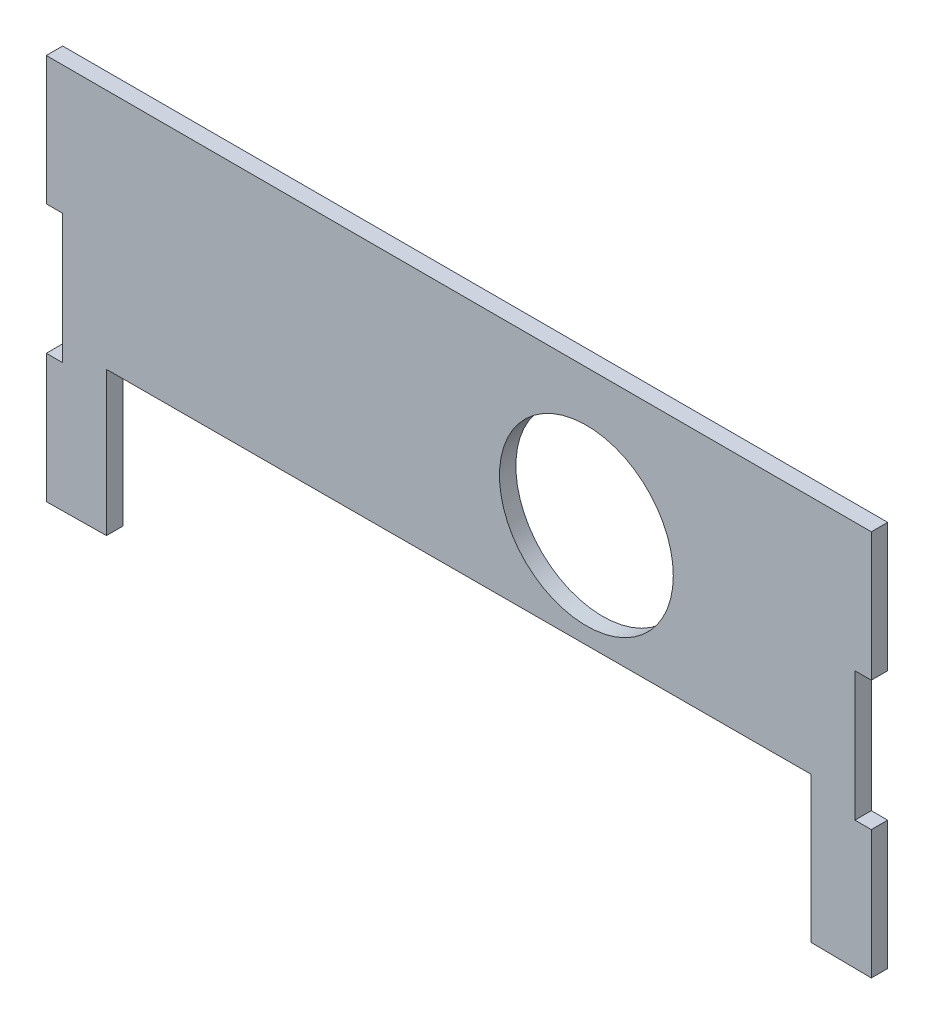
ISO-10303-21;
HEADER;
FILE_DESCRIPTION(('STEP AP214'),'2;1');
FILE_NAME('part.step','',(''),(''),'','','');
FILE_SCHEMA(('AUTOMOTIVE_DESIGN { 1 0 10303 214 1 1 1 1 }'));
ENDSEC;
DATA;
#1=APPLICATION_CONTEXT('core data for automotive mechanical design processes');
#2=APPLICATION_PROTOCOL_DEFINITION('international standard','automotive_design',2000,#1);
#3=PRODUCT_CONTEXT('',#1,'mechanical');
#4=PRODUCT('Part','Part','',(#3));
#5=PRODUCT_RELATED_PRODUCT_CATEGORY('part','',(#4));
#6=PRODUCT_DEFINITION_FORMATION('','',#4);
#7=PRODUCT_DEFINITION_CONTEXT('part definition',#1,'design');
#8=PRODUCT_DEFINITION('design','',#6,#7);
#9=PRODUCT_DEFINITION_SHAPE('','',#8);
#10=(LENGTH_UNIT() NAMED_UNIT(*) SI_UNIT(.MILLI.,.METRE.));
#11=(NAMED_UNIT(*) PLANE_ANGLE_UNIT() SI_UNIT($,.RADIAN.));
#12=(NAMED_UNIT(*) SI_UNIT($,.STERADIAN.) SOLID_ANGLE_UNIT());
#13=UNCERTAINTY_MEASURE_WITH_UNIT(LENGTH_MEASURE(1.E-05),#10,'distance_accuracy_value','');
#14=(GEOMETRIC_REPRESENTATION_CONTEXT(3) GLOBAL_UNCERTAINTY_ASSIGNED_CONTEXT((#13)) GLOBAL_UNIT_ASSIGNED_CONTEXT((#10,
#11,#12)) REPRESENTATION_CONTEXT('',''));
#15=CARTESIAN_POINT('',(0.,0.,0.));
#16=DIRECTION('',(0.,0.,1.));
#17=DIRECTION('',(1.,0.,0.));
#18=AXIS2_PLACEMENT_3D('',#15,#16,#17);
#19=CARTESIAN_POINT('',(0.,0.,3.));
#20=DIRECTION('',(0.,0.,1.));
#21=DIRECTION('',(1.,0.,0.));
#22=AXIS2_PLACEMENT_3D('',#19,#20,#21);
#23=PLANE('',#22);
#24=DIRECTION('',(-1.,0.,0.));
#25=VECTOR('',#24,1.);
#26=CARTESIAN_POINT('',(505.065088389252,145.519127811758,3.));
#27=LINE('',#26,#25);
#28=CARTESIAN_POINT('',(505.065088389252,145.519127811758,3.));
#29=VERTEX_POINT('',#28);
#30=CARTESIAN_POINT('',(502.065100889252,145.519127811758,3.));
#31=VERTEX_POINT('',#30);
#32=EDGE_CURVE('E210',#29,#31,#27,.T.);
#33=ORIENTED_EDGE('',*,*,#32,.T.);
#34=DIRECTION('',(0.,-1.,0.));
#35=VECTOR('',#34,1.);
#36=CARTESIAN_POINT('',(502.065100889252,145.519127811758,3.));
#37=LINE('',#36,#35);
#38=CARTESIAN_POINT('',(502.065100889252,121.994142811758,3.));
#39=VERTEX_POINT('',#38);
#40=EDGE_CURVE('E117',#31,#39,#37,.T.);
#41=ORIENTED_EDGE('',*,*,#40,.T.);
#42=DIRECTION('',(0.999932752619163,0.0115969926905187,0.));
#43=VECTOR('',#42,1.);
#44=CARTESIAN_POINT('',(502.065100889252,121.994142811758,3.));
#45=LINE('',#44,#43);
#46=CARTESIAN_POINT('',(513.080685889252,122.121899061758,3.));
#47=VERTEX_POINT('',#46);
#48=EDGE_CURVE('E249',#39,#47,#45,.T.);
#49=ORIENTED_EDGE('',*,*,#48,.T.);
#50=DIRECTION('',(0.,1.,0.));
#51=VECTOR('',#50,1.);
#52=CARTESIAN_POINT('',(513.080685889252,122.121899061758,3.));
#53=LINE('',#52,#51);
#54=CARTESIAN_POINT('',(513.080685889252,148.481991561758,3.));
#55=VERTEX_POINT('',#54);
#56=EDGE_CURVE('E268',#47,#55,#53,.T.);
#57=ORIENTED_EDGE('',*,*,#56,.T.);
#58=DIRECTION('',(0.999997520498716,0.00222688042353094,0.));
#59=VECTOR('',#58,1.);
#60=CARTESIAN_POINT('',(513.080685889252,148.481991561758,3.));
#61=LINE('',#60,#59);
#62=CARTESIAN_POINT('',(642.057879639252,148.769209061758,3.));
#63=VERTEX_POINT('',#62);
#64=EDGE_CURVE('E265',#55,#63,#61,.T.);
#65=ORIENTED_EDGE('',*,*,#64,.T.);
#66=DIRECTION('',(0.,-1.,0.));
#67=VECTOR('',#66,1.);
#68=CARTESIAN_POINT('',(642.057879639252,148.769209061758,3.));
#69=LINE('',#68,#67);
#70=CARTESIAN_POINT('',(642.057879639252,122.121899061758,3.));
#71=VERTEX_POINT('',#70);
#72=EDGE_CURVE('E267',#63,#71,#69,.T.);
#73=ORIENTED_EDGE('',*,*,#72,.T.);
#74=DIRECTION('',(0.999932650411179,-0.0116058020694212,0.));
#75=VECTOR('',#74,1.);
#76=CARTESIAN_POINT('',(642.057879639252,122.121899061758,3.));
#77=LINE('',#76,#75);
#78=CARTESIAN_POINT('',(653.065102139252,121.994142811758,3.));
#79=VERTEX_POINT('',#78);
#80=EDGE_CURVE('E270',#71,#79,#77,.T.);
#81=ORIENTED_EDGE('',*,*,#80,.T.);
#82=DIRECTION('',(0.,1.,0.));
#83=VECTOR('',#82,1.);
#84=CARTESIAN_POINT('',(653.065102139252,121.994142811758,3.));
#85=LINE('',#84,#83);
#86=CARTESIAN_POINT('',(653.065102139252,145.519127811758,3.));
#87=VERTEX_POINT('',#86);
#88=EDGE_CURVE('E276',#79,#87,#85,.T.);
#89=ORIENTED_EDGE('',*,*,#88,.T.);
#90=DIRECTION('',(-1.,0.,0.));
#91=VECTOR('',#90,1.);
#92=CARTESIAN_POINT('',(653.065102139252,145.519127811758,3.));
#93=LINE('',#92,#91);
#94=CARTESIAN_POINT('',(650.065115889252,145.519127811758,3.));
#95=VERTEX_POINT('',#94);
#96=EDGE_CURVE('E278',#87,#95,#93,.T.);
#97=ORIENTED_EDGE('',*,*,#96,.T.);
#98=DIRECTION('',(0.,1.,0.));
#99=VECTOR('',#98,1.);
#100=CARTESIAN_POINT('',(650.065115889252,145.519127811758,3.));
#101=LINE('',#100,#99);
#102=CARTESIAN_POINT('',(650.065115889252,169.194150311758,3.));
#103=VERTEX_POINT('',#102);
#104=EDGE_CURVE('E280',#95,#103,#101,.T.);
#105=ORIENTED_EDGE('',*,*,#104,.T.);
#106=DIRECTION('',(1.,0.,0.));
#107=VECTOR('',#106,1.);
#108=CARTESIAN_POINT('',(650.065115889252,169.194150311758,3.));
#109=LINE('',#108,#107);
#110=CARTESIAN_POINT('',(653.065102139252,169.194150311758,3.));
#111=VERTEX_POINT('',#110);
#112=EDGE_CURVE('E282',#103,#111,#109,.T.);
#113=ORIENTED_EDGE('',*,*,#112,.T.);
#114=DIRECTION('',(0.,1.,0.));
#115=VECTOR('',#114,1.);
#116=CARTESIAN_POINT('',(653.065102139252,169.194150311758,3.));
#117=LINE('',#116,#115);
#118=CARTESIAN_POINT('',(653.065102139252,192.719136561758,3.));
#119=VERTEX_POINT('',#118);
#120=EDGE_CURVE('E284',#111,#119,#117,.T.);
#121=ORIENTED_EDGE('',*,*,#120,.T.);
#122=DIRECTION('',(-1.,0.,0.));
#123=VECTOR('',#122,1.);
#124=CARTESIAN_POINT('',(653.065102139252,192.719136561758,3.));
#125=LINE('',#124,#123);
#126=CARTESIAN_POINT('',(502.065100889252,192.719136561758,3.));
#127=VERTEX_POINT('',#126);
#128=EDGE_CURVE('E160',#119,#127,#125,.T.);
#129=ORIENTED_EDGE('',*,*,#128,.T.);
#130=DIRECTION('',(0.,-1.,0.));
#131=VECTOR('',#130,1.);
#132=CARTESIAN_POINT('',(502.065100889252,192.719136561758,3.));
#133=LINE('',#132,#131);
#134=CARTESIAN_POINT('',(502.065100889252,169.194150311758,3.));
#135=VERTEX_POINT('',#134);
#136=EDGE_CURVE('E154',#127,#135,#133,.T.);
#137=ORIENTED_EDGE('',*,*,#136,.T.);
#138=DIRECTION('',(1.,0.,0.));
#139=VECTOR('',#138,1.);
#140=CARTESIAN_POINT('',(502.065100889252,169.194150311758,3.));
#141=LINE('',#140,#139);
#142=CARTESIAN_POINT('',(505.065088389252,169.194150311758,3.));
#143=VERTEX_POINT('',#142);
#144=EDGE_CURVE('E158',#135,#143,#141,.T.);
#145=ORIENTED_EDGE('',*,*,#144,.T.);
#146=DIRECTION('',(0.,-1.,0.));
#147=VECTOR('',#146,1.);
#148=CARTESIAN_POINT('',(505.065088389252,169.194150311758,3.));
#149=LINE('',#148,#147);
#150=EDGE_CURVE('E50',#143,#29,#149,.T.);
#151=ORIENTED_EDGE('',*,*,#150,.T.);
#152=EDGE_LOOP('',(#33,#41,#49,#57,#65,#73,#81,#89,#97,#105,#113,#121,#129,#137,#145,#151));
#153=FACE_BOUND('',#152,.T.);
#154=CARTESIAN_POINT('',(600.913930963202,167.632901285928,3.));
#155=DIRECTION('',(0.,0.,1.));
#156=DIRECTION('',(1.,0.,0.));
#157=AXIS2_PLACEMENT_3D('',#154,#155,#156);
#158=CIRCLE('',#157,15.9070385075479);
#159=CARTESIAN_POINT('',(616.82096947075,167.632901285928,3.));
#160=VERTEX_POINT('',#159);
#161=EDGE_CURVE('E182',#160,#160,#158,.T.);
#162=ORIENTED_EDGE('',*,*,#161,.F.);
#163=EDGE_LOOP('',(#162));
#164=FACE_BOUND('',#163,.T.);
#165=ADVANCED_FACE('F33',(#153,#164),#23,.T.);
#166=CARTESIAN_POINT('',(0.,0.,0.));
#167=DIRECTION('',(0.,0.,1.));
#168=DIRECTION('',(1.,0.,0.));
#169=AXIS2_PLACEMENT_3D('',#166,#167,#168);
#170=PLANE('',#169);
#171=DIRECTION('',(-1.,0.,0.));
#172=VECTOR('',#171,1.);
#173=CARTESIAN_POINT('',(505.065088389252,145.519127811758,0.));
#174=LINE('',#173,#172);
#175=CARTESIAN_POINT('',(505.065088389252,145.519127811758,0.));
#176=VERTEX_POINT('',#175);
#177=CARTESIAN_POINT('',(502.065100889252,145.519127811758,0.));
#178=VERTEX_POINT('',#177);
#179=EDGE_CURVE('E178',#176,#178,#174,.T.);
#180=ORIENTED_EDGE('',*,*,#179,.F.);
#181=DIRECTION('',(0.,-1.,0.));
#182=VECTOR('',#181,1.);
#183=CARTESIAN_POINT('',(505.065088389252,169.194150311758,0.));
#184=LINE('',#183,#182);
#185=CARTESIAN_POINT('',(505.065088389252,169.194150311758,0.));
#186=VERTEX_POINT('',#185);
#187=EDGE_CURVE('E109',#186,#176,#184,.T.);
#188=ORIENTED_EDGE('',*,*,#187,.F.);
#189=DIRECTION('',(1.,0.,0.));
#190=VECTOR('',#189,1.);
#191=CARTESIAN_POINT('',(502.065100889252,169.194150311758,0.));
#192=LINE('',#191,#190);
#193=CARTESIAN_POINT('',(502.065100889252,169.194150311758,0.));
#194=VERTEX_POINT('',#193);
#195=EDGE_CURVE('E103',#194,#186,#192,.T.);
#196=ORIENTED_EDGE('',*,*,#195,.F.);
#197=DIRECTION('',(0.,-1.,0.));
#198=VECTOR('',#197,1.);
#199=CARTESIAN_POINT('',(502.065100889252,192.719136561758,0.));
#200=LINE('',#199,#198);
#201=CARTESIAN_POINT('',(502.065100889252,192.719136561758,0.));
#202=VERTEX_POINT('',#201);
#203=EDGE_CURVE('E168',#202,#194,#200,.T.);
#204=ORIENTED_EDGE('',*,*,#203,.F.);
#205=DIRECTION('',(-1.,0.,0.));
#206=VECTOR('',#205,1.);
#207=CARTESIAN_POINT('',(505.065094639252,192.719136561758,0.));
#208=LINE('',#207,#206);
#209=CARTESIAN_POINT('',(653.065102139252,192.719136561758,0.));
#210=VERTEX_POINT('',#209);
#211=EDGE_CURVE('E205',#210,#202,#208,.T.);
#212=ORIENTED_EDGE('',*,*,#211,.F.);
#213=DIRECTION('',(0.,1.,0.));
#214=VECTOR('',#213,1.);
#215=CARTESIAN_POINT('',(653.065102139252,169.194150311758,0.));
#216=LINE('',#215,#214);
#217=CARTESIAN_POINT('',(653.065102139252,169.194150311758,0.));
#218=VERTEX_POINT('',#217);
#219=EDGE_CURVE('E202',#218,#210,#216,.T.);
#220=ORIENTED_EDGE('',*,*,#219,.F.);
#221=DIRECTION('',(1.,0.,0.));
#222=VECTOR('',#221,1.);
#223=CARTESIAN_POINT('',(650.065115889252,169.194150311758,0.));
#224=LINE('',#223,#222);
#225=CARTESIAN_POINT('',(650.065115889252,169.194150311758,0.));
#226=VERTEX_POINT('',#225);
#227=EDGE_CURVE('E200',#226,#218,#224,.T.);
#228=ORIENTED_EDGE('',*,*,#227,.F.);
#229=DIRECTION('',(0.,1.,0.));
#230=VECTOR('',#229,1.);
#231=CARTESIAN_POINT('',(650.065115889252,145.519127811758,0.));
#232=LINE('',#231,#230);
#233=CARTESIAN_POINT('',(650.065115889252,145.519127811758,0.));
#234=VERTEX_POINT('',#233);
#235=EDGE_CURVE('E198',#234,#226,#232,.T.);
#236=ORIENTED_EDGE('',*,*,#235,.F.);
#237=DIRECTION('',(-1.,0.,0.));
#238=VECTOR('',#237,1.);
#239=CARTESIAN_POINT('',(653.065102139252,145.519127811758,0.));
#240=LINE('',#239,#238);
#241=CARTESIAN_POINT('',(653.065102139252,145.519127811758,0.));
#242=VERTEX_POINT('',#241);
#243=EDGE_CURVE('E196',#242,#234,#240,.T.);
#244=ORIENTED_EDGE('',*,*,#243,.F.);
#245=DIRECTION('',(0.,1.,0.));
#246=VECTOR('',#245,1.);
#247=CARTESIAN_POINT('',(653.065102139252,121.994142811758,0.));
#248=LINE('',#247,#246);
#249=CARTESIAN_POINT('',(653.065102139252,121.994142811758,0.));
#250=VERTEX_POINT('',#249);
#251=EDGE_CURVE('E194',#250,#242,#248,.T.);
#252=ORIENTED_EDGE('',*,*,#251,.F.);
#253=DIRECTION('',(0.999932650411179,-0.0116058020694212,0.));
#254=VECTOR('',#253,1.);
#255=CARTESIAN_POINT('',(642.057879639252,122.121899061758,0.));
#256=LINE('',#255,#254);
#257=CARTESIAN_POINT('',(642.057879639252,122.121899061758,0.));
#258=VERTEX_POINT('',#257);
#259=EDGE_CURVE('E192',#258,#250,#256,.T.);
#260=ORIENTED_EDGE('',*,*,#259,.F.);
#261=DIRECTION('',(0.,-1.,0.));
#262=VECTOR('',#261,1.);
#263=CARTESIAN_POINT('',(642.057879639252,148.769209061758,0.));
#264=LINE('',#263,#262);
#265=CARTESIAN_POINT('',(642.057879639252,148.769209061758,0.));
#266=VERTEX_POINT('',#265);
#267=EDGE_CURVE('E190',#266,#258,#264,.T.);
#268=ORIENTED_EDGE('',*,*,#267,.F.);
#269=DIRECTION('',(0.999997520498716,0.00222688042353094,0.));
#270=VECTOR('',#269,1.);
#271=CARTESIAN_POINT('',(513.080685889252,148.481991561758,0.));
#272=LINE('',#271,#270);
#273=CARTESIAN_POINT('',(513.080685889252,148.481991561758,0.));
#274=VERTEX_POINT('',#273);
#275=EDGE_CURVE('E188',#274,#266,#272,.T.);
#276=ORIENTED_EDGE('',*,*,#275,.F.);
#277=DIRECTION('',(0.,1.,0.));
#278=VECTOR('',#277,1.);
#279=CARTESIAN_POINT('',(513.080685889252,122.121899061758,0.));
#280=LINE('',#279,#278);
#281=CARTESIAN_POINT('',(513.080685889252,122.121899061758,0.));
#282=VERTEX_POINT('',#281);
#283=EDGE_CURVE('E186',#282,#274,#280,.T.);
#284=ORIENTED_EDGE('',*,*,#283,.F.);
#285=DIRECTION('',(0.999932752619163,0.0115969926905187,0.));
#286=VECTOR('',#285,1.);
#287=CARTESIAN_POINT('',(502.065100889252,121.994142811758,0.));
#288=LINE('',#287,#286);
#289=CARTESIAN_POINT('',(502.065100889252,121.994142811758,0.));
#290=VERTEX_POINT('',#289);
#291=EDGE_CURVE('E184',#290,#282,#288,.T.);
#292=ORIENTED_EDGE('',*,*,#291,.F.);
#293=DIRECTION('',(0.,-1.,0.));
#294=VECTOR('',#293,1.);
#295=CARTESIAN_POINT('',(502.065100889252,145.519127811758,0.));
#296=LINE('',#295,#294);
#297=EDGE_CURVE('E181',#178,#290,#296,.T.);
#298=ORIENTED_EDGE('',*,*,#297,.F.);
#299=EDGE_LOOP('',(#180,#188,#196,#204,#212,#220,#228,#236,#244,#252,#260,#268,#276,#284,#292,#298));
#300=FACE_BOUND('',#299,.T.);
#301=CARTESIAN_POINT('',(600.913930963202,167.632901285928,0.));
#302=DIRECTION('',(0.,0.,1.));
#303=DIRECTION('',(1.,0.,0.));
#304=AXIS2_PLACEMENT_3D('',#301,#302,#303);
#305=CIRCLE('',#304,15.9070385075479);
#306=CARTESIAN_POINT('',(616.82096947075,167.632901285928,0.));
#307=VERTEX_POINT('',#306);
#308=EDGE_CURVE('E488',#307,#307,#305,.T.);
#309=ORIENTED_EDGE('',*,*,#308,.T.);
#310=EDGE_LOOP('',(#309));
#311=FACE_BOUND('',#310,.T.);
#312=ADVANCED_FACE('F253',(#300,#311),#170,.F.);
#313=CARTESIAN_POINT('',(505.065088389252,145.519127811758,3.));
#314=DIRECTION('',(0.,-1.,0.));
#315=DIRECTION('',(0.,0.,-1.));
#316=AXIS2_PLACEMENT_3D('',#313,#314,#315);
#317=PLANE('',#316);
#318=ORIENTED_EDGE('',*,*,#179,.T.);
#319=DIRECTION('',(0.,0.,-1.));
#320=VECTOR('',#319,1.);
#321=CARTESIAN_POINT('',(502.065100889252,145.519127811758,3.));
#322=LINE('',#321,#320);
#323=EDGE_CURVE('E11',#31,#178,#322,.T.);
#324=ORIENTED_EDGE('',*,*,#323,.F.);
#325=ORIENTED_EDGE('',*,*,#32,.F.);
#326=DIRECTION('',(0.,0.,-1.));
#327=VECTOR('',#326,1.);
#328=CARTESIAN_POINT('',(505.065088389252,145.519127811758,3.));
#329=LINE('',#328,#327);
#330=EDGE_CURVE('E174',#29,#176,#329,.T.);
#331=ORIENTED_EDGE('',*,*,#330,.T.);
#332=EDGE_LOOP('',(#318,#324,#325,#331));
#333=FACE_BOUND('',#332,.T.);
#334=ADVANCED_FACE('F35',(#333),#317,.F.);
#335=CARTESIAN_POINT('',(502.065100889252,145.519127811758,3.));
#336=DIRECTION('',(1.,0.,0.));
#337=DIRECTION('',(0.,0.,-1.));
#338=AXIS2_PLACEMENT_3D('',#335,#336,#337);
#339=PLANE('',#338);
#340=ORIENTED_EDGE('',*,*,#297,.T.);
#341=DIRECTION('',(0.,0.,-1.));
#342=VECTOR('',#341,1.);
#343=CARTESIAN_POINT('',(502.065100889252,121.994142811758,3.));
#344=LINE('',#343,#342);
#345=EDGE_CURVE('E42',#39,#290,#344,.T.);
#346=ORIENTED_EDGE('',*,*,#345,.F.);
#347=ORIENTED_EDGE('',*,*,#40,.F.);
#348=ORIENTED_EDGE('',*,*,#323,.T.);
#349=EDGE_LOOP('',(#340,#346,#347,#348));
#350=FACE_BOUND('',#349,.T.);
#351=ADVANCED_FACE('F317',(#350),#339,.F.);
#352=CARTESIAN_POINT('',(502.065100889252,121.994142811758,3.));
#353=DIRECTION('',(-0.0115969926905187,0.999932752619163,0.));
#354=DIRECTION('',(-0.999932752619163,-0.0115969926905187,0.));
#355=AXIS2_PLACEMENT_3D('',#352,#353,#354);
#356=PLANE('',#355);
#357=ORIENTED_EDGE('',*,*,#291,.T.);
#358=DIRECTION('',(0.,0.,-1.));
#359=VECTOR('',#358,1.);
#360=CARTESIAN_POINT('',(513.080685889252,122.121899061758,3.));
#361=LINE('',#360,#359);
#362=EDGE_CURVE('E241',#47,#282,#361,.T.);
#363=ORIENTED_EDGE('',*,*,#362,.F.);
#364=ORIENTED_EDGE('',*,*,#48,.F.);
#365=ORIENTED_EDGE('',*,*,#345,.T.);
#366=EDGE_LOOP('',(#357,#363,#364,#365));
#367=FACE_BOUND('',#366,.T.);
#368=ADVANCED_FACE('F247',(#367),#356,.F.);
#369=CARTESIAN_POINT('',(513.080685889252,122.121899061758,3.));
#370=DIRECTION('',(-1.,0.,0.));
#371=DIRECTION('',(0.,0.,1.));
#372=AXIS2_PLACEMENT_3D('',#369,#370,#371);
#373=PLANE('',#372);
#374=ORIENTED_EDGE('',*,*,#283,.T.);
#375=DIRECTION('',(0.,0.,-1.));
#376=VECTOR('',#375,1.);
#377=CARTESIAN_POINT('',(513.080685889252,148.481991561758,3.));
#378=LINE('',#377,#376);
#379=EDGE_CURVE('E238',#55,#274,#378,.T.);
#380=ORIENTED_EDGE('',*,*,#379,.F.);
#381=ORIENTED_EDGE('',*,*,#56,.F.);
#382=ORIENTED_EDGE('',*,*,#362,.T.);
#383=EDGE_LOOP('',(#374,#380,#381,#382));
#384=FACE_BOUND('',#383,.T.);
#385=ADVANCED_FACE('F259',(#384),#373,.F.);
#386=CARTESIAN_POINT('',(513.080685889252,148.481991561758,3.));
#387=DIRECTION('',(-0.00222688042353094,0.999997520498716,0.));
#388=DIRECTION('',(-0.999997520498716,-0.00222688042353094,0.));
#389=AXIS2_PLACEMENT_3D('',#386,#387,#388);
#390=PLANE('',#389);
#391=ORIENTED_EDGE('',*,*,#275,.T.);
#392=DIRECTION('',(0.,0.,-1.));
#393=VECTOR('',#392,1.);
#394=CARTESIAN_POINT('',(642.057879639252,148.769209061758,3.));
#395=LINE('',#394,#393);
#396=EDGE_CURVE('E235',#63,#266,#395,.T.);
#397=ORIENTED_EDGE('',*,*,#396,.F.);
#398=ORIENTED_EDGE('',*,*,#64,.F.);
#399=ORIENTED_EDGE('',*,*,#379,.T.);
#400=EDGE_LOOP('',(#391,#397,#398,#399));
#401=FACE_BOUND('',#400,.T.);
#402=ADVANCED_FACE('F263',(#401),#390,.F.);
#403=CARTESIAN_POINT('',(642.057879639252,148.769209061758,3.));
#404=DIRECTION('',(1.,0.,0.));
#405=DIRECTION('',(0.,0.,-1.));
#406=AXIS2_PLACEMENT_3D('',#403,#404,#405);
#407=PLANE('',#406);
#408=ORIENTED_EDGE('',*,*,#267,.T.);
#409=DIRECTION('',(0.,0.,-1.));
#410=VECTOR('',#409,1.);
#411=CARTESIAN_POINT('',(642.057879639252,122.121899061758,3.));
#412=LINE('',#411,#410);
#413=EDGE_CURVE('E232',#71,#258,#412,.T.);
#414=ORIENTED_EDGE('',*,*,#413,.F.);
#415=ORIENTED_EDGE('',*,*,#72,.F.);
#416=ORIENTED_EDGE('',*,*,#396,.T.);
#417=EDGE_LOOP('',(#408,#414,#415,#416));
#418=FACE_BOUND('',#417,.T.);
#419=ADVANCED_FACE('F330',(#418),#407,.F.);
#420=CARTESIAN_POINT('',(642.057879639252,122.121899061758,3.));
#421=DIRECTION('',(0.0116058020694212,0.999932650411179,0.));
#422=DIRECTION('',(-0.999932650411179,0.0116058020694212,0.));
#423=AXIS2_PLACEMENT_3D('',#420,#421,#422);
#424=PLANE('',#423);
#425=ORIENTED_EDGE('',*,*,#259,.T.);
#426=DIRECTION('',(0.,0.,-1.));
#427=VECTOR('',#426,1.);
#428=CARTESIAN_POINT('',(653.065102139252,121.994142811758,3.));
#429=LINE('',#428,#427);
#430=EDGE_CURVE('E229',#79,#250,#429,.T.);
#431=ORIENTED_EDGE('',*,*,#430,.F.);
#432=ORIENTED_EDGE('',*,*,#80,.F.);
#433=ORIENTED_EDGE('',*,*,#413,.T.);
#434=EDGE_LOOP('',(#425,#431,#432,#433));
#435=FACE_BOUND('',#434,.T.);
#436=ADVANCED_FACE('F333',(#435),#424,.F.);
#437=CARTESIAN_POINT('',(653.065102139252,121.994142811758,3.));
#438=DIRECTION('',(-1.,0.,0.));
#439=DIRECTION('',(0.,0.,1.));
#440=AXIS2_PLACEMENT_3D('',#437,#438,#439);
#441=PLANE('',#440);
#442=ORIENTED_EDGE('',*,*,#251,.T.);
#443=DIRECTION('',(0.,0.,-1.));
#444=VECTOR('',#443,1.);
#445=CARTESIAN_POINT('',(653.065102139252,145.519127811758,3.));
#446=LINE('',#445,#444);
#447=EDGE_CURVE('E226',#87,#242,#446,.T.);
#448=ORIENTED_EDGE('',*,*,#447,.F.);
#449=ORIENTED_EDGE('',*,*,#88,.F.);
#450=ORIENTED_EDGE('',*,*,#430,.T.);
#451=EDGE_LOOP('',(#442,#448,#449,#450));
#452=FACE_BOUND('',#451,.T.);
#453=ADVANCED_FACE('F337',(#452),#441,.F.);
#454=CARTESIAN_POINT('',(653.065102139252,145.519127811758,3.));
#455=DIRECTION('',(0.,-1.,0.));
#456=DIRECTION('',(0.,0.,-1.));
#457=AXIS2_PLACEMENT_3D('',#454,#455,#456);
#458=PLANE('',#457);
#459=ORIENTED_EDGE('',*,*,#243,.T.);
#460=DIRECTION('',(0.,0.,-1.));
#461=VECTOR('',#460,1.);
#462=CARTESIAN_POINT('',(650.065115889252,145.519127811758,3.));
#463=LINE('',#462,#461);
#464=EDGE_CURVE('E223',#95,#234,#463,.T.);
#465=ORIENTED_EDGE('',*,*,#464,.F.);
#466=ORIENTED_EDGE('',*,*,#96,.F.);
#467=ORIENTED_EDGE('',*,*,#447,.T.);
#468=EDGE_LOOP('',(#459,#465,#466,#467));
#469=FACE_BOUND('',#468,.T.);
#470=ADVANCED_FACE('F341',(#469),#458,.F.);
#471=CARTESIAN_POINT('',(650.065115889252,145.519127811758,3.));
#472=DIRECTION('',(-1.,0.,0.));
#473=DIRECTION('',(0.,0.,1.));
#474=AXIS2_PLACEMENT_3D('',#471,#472,#473);
#475=PLANE('',#474);
#476=ORIENTED_EDGE('',*,*,#235,.T.);
#477=DIRECTION('',(0.,0.,-1.));
#478=VECTOR('',#477,1.);
#479=CARTESIAN_POINT('',(650.065115889252,169.194150311758,3.));
#480=LINE('',#479,#478);
#481=EDGE_CURVE('E220',#103,#226,#480,.T.);
#482=ORIENTED_EDGE('',*,*,#481,.F.);
#483=ORIENTED_EDGE('',*,*,#104,.F.);
#484=ORIENTED_EDGE('',*,*,#464,.T.);
#485=EDGE_LOOP('',(#476,#482,#483,#484));
#486=FACE_BOUND('',#485,.T.);
#487=ADVANCED_FACE('F345',(#486),#475,.F.);
#488=CARTESIAN_POINT('',(650.065115889252,169.194150311758,3.));
#489=DIRECTION('',(0.,1.,0.));
#490=DIRECTION('',(0.,0.,1.));
#491=AXIS2_PLACEMENT_3D('',#488,#489,#490);
#492=PLANE('',#491);
#493=ORIENTED_EDGE('',*,*,#227,.T.);
#494=DIRECTION('',(0.,0.,-1.));
#495=VECTOR('',#494,1.);
#496=CARTESIAN_POINT('',(653.065102139252,169.194150311758,3.));
#497=LINE('',#496,#495);
#498=EDGE_CURVE('E217',#111,#218,#497,.T.);
#499=ORIENTED_EDGE('',*,*,#498,.F.);
#500=ORIENTED_EDGE('',*,*,#112,.F.);
#501=ORIENTED_EDGE('',*,*,#481,.T.);
#502=EDGE_LOOP('',(#493,#499,#500,#501));
#503=FACE_BOUND('',#502,.T.);
#504=ADVANCED_FACE('F349',(#503),#492,.F.);
#505=CARTESIAN_POINT('',(653.065102139252,169.194150311758,3.));
#506=DIRECTION('',(-1.,0.,0.));
#507=DIRECTION('',(0.,0.,1.));
#508=AXIS2_PLACEMENT_3D('',#505,#506,#507);
#509=PLANE('',#508);
#510=ORIENTED_EDGE('',*,*,#219,.T.);
#511=DIRECTION('',(0.,0.,-1.));
#512=VECTOR('',#511,1.);
#513=CARTESIAN_POINT('',(653.065102139252,192.719136561758,3.));
#514=LINE('',#513,#512);
#515=EDGE_CURVE('E214',#119,#210,#514,.T.);
#516=ORIENTED_EDGE('',*,*,#515,.F.);
#517=ORIENTED_EDGE('',*,*,#120,.F.);
#518=ORIENTED_EDGE('',*,*,#498,.T.);
#519=EDGE_LOOP('',(#510,#516,#517,#518));
#520=FACE_BOUND('',#519,.T.);
#521=ADVANCED_FACE('F290',(#520),#509,.F.);
#522=CARTESIAN_POINT('',(505.065094639252,192.719136561758,3.));
#523=DIRECTION('',(0.,-1.,0.));
#524=DIRECTION('',(0.,0.,-1.));
#525=AXIS2_PLACEMENT_3D('',#522,#523,#524);
#526=PLANE('',#525);
#527=ORIENTED_EDGE('',*,*,#211,.T.);
#528=DIRECTION('',(0.,0.,-1.));
#529=VECTOR('',#528,1.);
#530=CARTESIAN_POINT('',(502.065100889252,192.719136561758,3.));
#531=LINE('',#530,#529);
#532=EDGE_CURVE('E169',#127,#202,#531,.T.);
#533=ORIENTED_EDGE('',*,*,#532,.F.);
#534=ORIENTED_EDGE('',*,*,#128,.F.);
#535=ORIENTED_EDGE('',*,*,#515,.T.);
#536=EDGE_LOOP('',(#527,#533,#534,#535));
#537=FACE_BOUND('',#536,.T.);
#538=ADVANCED_FACE('F293',(#537),#526,.F.);
#539=CARTESIAN_POINT('',(502.065100889252,192.719136561758,3.));
#540=DIRECTION('',(1.,0.,0.));
#541=DIRECTION('',(0.,0.,-1.));
#542=AXIS2_PLACEMENT_3D('',#539,#540,#541);
#543=PLANE('',#542);
#544=ORIENTED_EDGE('',*,*,#203,.T.);
#545=DIRECTION('',(0.,0.,-1.));
#546=VECTOR('',#545,1.);
#547=CARTESIAN_POINT('',(502.065100889252,169.194150311758,3.));
#548=LINE('',#547,#546);
#549=EDGE_CURVE('E165',#135,#194,#548,.T.);
#550=ORIENTED_EDGE('',*,*,#549,.F.);
#551=ORIENTED_EDGE('',*,*,#136,.F.);
#552=ORIENTED_EDGE('',*,*,#532,.T.);
#553=EDGE_LOOP('',(#544,#550,#551,#552));
#554=FACE_BOUND('',#553,.T.);
#555=ADVANCED_FACE('F166',(#554),#543,.F.);
#556=CARTESIAN_POINT('',(502.065100889252,169.194150311758,3.));
#557=DIRECTION('',(0.,1.,0.));
#558=DIRECTION('',(0.,0.,1.));
#559=AXIS2_PLACEMENT_3D('',#556,#557,#558);
#560=PLANE('',#559);
#561=ORIENTED_EDGE('',*,*,#195,.T.);
#562=DIRECTION('',(0.,0.,-1.));
#563=VECTOR('',#562,1.);
#564=CARTESIAN_POINT('',(505.065088389252,169.194150311758,3.));
#565=LINE('',#564,#563);
#566=EDGE_CURVE('E170',#143,#186,#565,.T.);
#567=ORIENTED_EDGE('',*,*,#566,.F.);
#568=ORIENTED_EDGE('',*,*,#144,.F.);
#569=ORIENTED_EDGE('',*,*,#549,.T.);
#570=EDGE_LOOP('',(#561,#567,#568,#569));
#571=FACE_BOUND('',#570,.T.);
#572=ADVANCED_FACE('F172',(#571),#560,.F.);
#573=CARTESIAN_POINT('',(505.065088389252,169.194150311758,3.));
#574=DIRECTION('',(1.,0.,0.));
#575=DIRECTION('',(0.,0.,-1.));
#576=AXIS2_PLACEMENT_3D('',#573,#574,#575);
#577=PLANE('',#576);
#578=ORIENTED_EDGE('',*,*,#187,.T.);
#579=ORIENTED_EDGE('',*,*,#330,.F.);
#580=ORIENTED_EDGE('',*,*,#150,.F.);
#581=ORIENTED_EDGE('',*,*,#566,.T.);
#582=EDGE_LOOP('',(#578,#579,#580,#581));
#583=FACE_BOUND('',#582,.T.);
#584=ADVANCED_FACE('F297',(#583),#577,.F.);
#585=CARTESIAN_POINT('',(600.913930963202,167.632901285928,3.));
#586=DIRECTION('',(0.,0.,-1.));
#587=DIRECTION('',(-1.,0.,0.));
#588=AXIS2_PLACEMENT_3D('',#585,#586,#587);
#589=CYLINDRICAL_SURFACE('',#588,15.9070385075479);
#590=ORIENTED_EDGE('',*,*,#161,.T.);
#591=EDGE_LOOP('',(#590));
#592=FACE_BOUND('',#591,.T.);
#593=ORIENTED_EDGE('',*,*,#308,.F.);
#594=EDGE_LOOP('',(#593));
#595=FACE_BOUND('',#594,.T.);
#596=ADVANCED_FACE('F299',(#592,#595),#589,.F.);
#597=CLOSED_SHELL('',(#165,#312,#334,#351,#368,#385,#402,#419,#436,#453,#470,#487,#504,#521,
#538,#555,#572,#584,#596));
#598=MANIFOLD_SOLID_BREP('B2',#597);
#599=ADVANCED_BREP_SHAPE_REPRESENTATION('',(#18,#598),#14);
#600=SHAPE_DEFINITION_REPRESENTATION(#9,#599);
ENDSEC;
END-ISO-10303-21;
